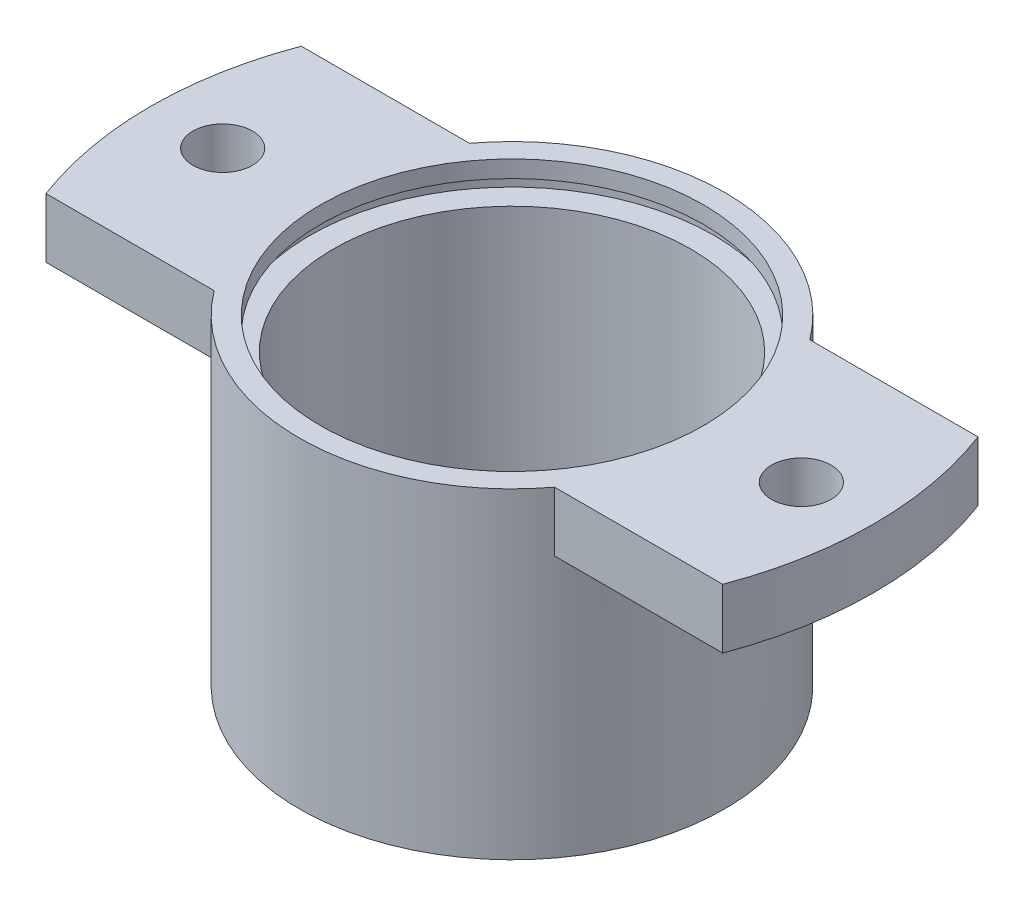
ISO-10303-21;
HEADER;
FILE_DESCRIPTION(('STEP AP214'),'2;1');
FILE_NAME('part.step','',(''),(''),'','','');
FILE_SCHEMA(('AUTOMOTIVE_DESIGN { 1 0 10303 214 1 1 1 1 }'));
ENDSEC;
DATA;
#1=APPLICATION_CONTEXT('core data for automotive mechanical design processes');
#2=APPLICATION_PROTOCOL_DEFINITION('international standard','automotive_design',2000,#1);
#3=PRODUCT_CONTEXT('',#1,'mechanical');
#4=PRODUCT('Part','Part','',(#3));
#5=PRODUCT_RELATED_PRODUCT_CATEGORY('part','',(#4));
#6=PRODUCT_DEFINITION_FORMATION('','',#4);
#7=PRODUCT_DEFINITION_CONTEXT('part definition',#1,'design');
#8=PRODUCT_DEFINITION('design','',#6,#7);
#9=PRODUCT_DEFINITION_SHAPE('','',#8);
#10=(LENGTH_UNIT() NAMED_UNIT(*) SI_UNIT(.MILLI.,.METRE.));
#11=(NAMED_UNIT(*) PLANE_ANGLE_UNIT() SI_UNIT($,.RADIAN.));
#12=(NAMED_UNIT(*) SI_UNIT($,.STERADIAN.) SOLID_ANGLE_UNIT());
#13=UNCERTAINTY_MEASURE_WITH_UNIT(LENGTH_MEASURE(1.E-05),#10,'distance_accuracy_value','');
#14=(GEOMETRIC_REPRESENTATION_CONTEXT(3) GLOBAL_UNCERTAINTY_ASSIGNED_CONTEXT((#13)) GLOBAL_UNIT_ASSIGNED_CONTEXT((#10,
#11,#12)) REPRESENTATION_CONTEXT('',''));
#15=CARTESIAN_POINT('',(0.,0.,0.));
#16=DIRECTION('',(0.,0.,1.));
#17=DIRECTION('',(1.,0.,0.));
#18=AXIS2_PLACEMENT_3D('',#15,#16,#17);
#19=CARTESIAN_POINT('',(0.,37.75,22.4999999999957));
#20=DIRECTION('',(0.,-1.,0.));
#21=DIRECTION('',(0.,0.,-1.));
#22=AXIS2_PLACEMENT_3D('',#19,#20,#21);
#23=PLANE('',#22);
#24=CARTESIAN_POINT('',(34.,37.75,0.));
#25=DIRECTION('',(0.,1.,0.));
#26=DIRECTION('',(0.,0.,1.));
#27=AXIS2_PLACEMENT_3D('',#24,#25,#26);
#28=CIRCLE('',#27,3.5);
#29=CARTESIAN_POINT('',(34.,37.75,3.5));
#30=VERTEX_POINT('',#29);
#31=EDGE_CURVE('E232',#30,#30,#28,.T.);
#32=ORIENTED_EDGE('',*,*,#31,.F.);
#33=EDGE_LOOP('',(#32));
#34=FACE_BOUND('',#33,.T.);
#35=CARTESIAN_POINT('',(-34.,37.75,0.));
#36=DIRECTION('',(0.,1.,0.));
#37=DIRECTION('',(0.,0.,1.));
#38=AXIS2_PLACEMENT_3D('',#35,#36,#37);
#39=CIRCLE('',#38,3.5);
#40=CARTESIAN_POINT('',(-34.,37.75,3.5));
#41=VERTEX_POINT('',#40);
#42=EDGE_CURVE('E122',#41,#41,#39,.T.);
#43=ORIENTED_EDGE('',*,*,#42,.F.);
#44=EDGE_LOOP('',(#43));
#45=FACE_BOUND('',#44,.T.);
#46=CARTESIAN_POINT('',(0.,37.75,0.));
#47=DIRECTION('',(0.,-1.,0.));
#48=DIRECTION('',(0.,0.,-1.));
#49=AXIS2_PLACEMENT_3D('',#46,#47,#48);
#50=CIRCLE('',#49,25.);
#51=CARTESIAN_POINT('',(-20.,37.75,-15.));
#52=VERTEX_POINT('',#51);
#53=CARTESIAN_POINT('',(20.,37.75,-15.));
#54=VERTEX_POINT('',#53);
#55=EDGE_CURVE('E11',#52,#54,#50,.T.);
#56=ORIENTED_EDGE('',*,*,#55,.F.);
#57=DIRECTION('',(-1.,0.,0.));
#58=VECTOR('',#57,1.);
#59=CARTESIAN_POINT('',(-20.,37.75,-15.));
#60=LINE('',#59,#58);
#61=CARTESIAN_POINT('',(-39.7649343014672,37.75,-15.));
#62=VERTEX_POINT('',#61);
#63=EDGE_CURVE('E132',#52,#62,#60,.T.);
#64=ORIENTED_EDGE('',*,*,#63,.T.);
#65=CARTESIAN_POINT('',(0.,37.75,0.));
#66=DIRECTION('',(0.,1.,0.));
#67=DIRECTION('',(0.,0.,1.));
#68=AXIS2_PLACEMENT_3D('',#65,#66,#67);
#69=CIRCLE('',#68,42.5);
#70=CARTESIAN_POINT('',(-39.7649343014672,37.75,15.));
#71=VERTEX_POINT('',#70);
#72=EDGE_CURVE('E151',#62,#71,#69,.T.);
#73=ORIENTED_EDGE('',*,*,#72,.T.);
#74=DIRECTION('',(1.,0.,0.));
#75=VECTOR('',#74,1.);
#76=CARTESIAN_POINT('',(-39.7649343014672,37.75,15.));
#77=LINE('',#76,#75);
#78=CARTESIAN_POINT('',(-20.,37.75,15.));
#79=VERTEX_POINT('',#78);
#80=EDGE_CURVE('E139',#71,#79,#77,.T.);
#81=ORIENTED_EDGE('',*,*,#80,.T.);
#82=CARTESIAN_POINT('',(20.,37.75,15.));
#83=VERTEX_POINT('',#82);
#84=EDGE_CURVE('E41',#83,#79,#50,.T.);
#85=ORIENTED_EDGE('',*,*,#84,.F.);
#86=DIRECTION('',(1.,0.,0.));
#87=VECTOR('',#86,1.);
#88=CARTESIAN_POINT('',(20.,37.75,15.));
#89=LINE('',#88,#87);
#90=CARTESIAN_POINT('',(39.7649343014672,37.75,15.));
#91=VERTEX_POINT('',#90);
#92=EDGE_CURVE('E117',#83,#91,#89,.T.);
#93=ORIENTED_EDGE('',*,*,#92,.T.);
#94=CARTESIAN_POINT('',(0.,37.75,0.));
#95=DIRECTION('',(0.,1.,0.));
#96=DIRECTION('',(0.,0.,1.));
#97=AXIS2_PLACEMENT_3D('',#94,#95,#96);
#98=CIRCLE('',#97,42.5);
#99=CARTESIAN_POINT('',(39.7649343014672,37.75,-15.));
#100=VERTEX_POINT('',#99);
#101=EDGE_CURVE('E127',#91,#100,#98,.T.);
#102=ORIENTED_EDGE('',*,*,#101,.T.);
#103=DIRECTION('',(-1.,0.,0.));
#104=VECTOR('',#103,1.);
#105=CARTESIAN_POINT('',(39.7649343014672,37.75,-15.));
#106=LINE('',#105,#104);
#107=EDGE_CURVE('E101',#100,#54,#106,.T.);
#108=ORIENTED_EDGE('',*,*,#107,.T.);
#109=EDGE_LOOP('',(#56,#64,#73,#81,#85,#93,#102,#108));
#110=FACE_BOUND('',#109,.T.);
#111=CARTESIAN_POINT('',(0.,37.75,0.));
#112=DIRECTION('',(0.,-1.,0.));
#113=DIRECTION('',(0.,0.,-1.));
#114=AXIS2_PLACEMENT_3D('',#111,#112,#113);
#115=CIRCLE('',#114,22.4999999999957);
#116=CARTESIAN_POINT('',(0.,37.75,-22.4999999999957));
#117=VERTEX_POINT('',#116);
#118=EDGE_CURVE('E159',#117,#117,#115,.T.);
#119=ORIENTED_EDGE('',*,*,#118,.T.);
#120=EDGE_LOOP('',(#119));
#121=FACE_BOUND('',#120,.T.);
#122=ADVANCED_FACE('F34',(#34,#45,#110,#121),#23,.F.);
#123=CARTESIAN_POINT('',(0.,-1.11792486059608,0.));
#124=DIRECTION('',(0.,-1.,0.));
#125=DIRECTION('',(0.,0.,-1.));
#126=AXIS2_PLACEMENT_3D('',#123,#124,#125);
#127=CYLINDRICAL_SURFACE('',#126,25.);
#128=CARTESIAN_POINT('',(0.,30.75,0.));
#129=DIRECTION('',(0.,-1.,0.));
#130=DIRECTION('',(0.,0.,1.));
#131=AXIS2_PLACEMENT_3D('',#128,#129,#130);
#132=CIRCLE('',#131,25.);
#133=CARTESIAN_POINT('',(20.,30.75,-15.));
#134=VERTEX_POINT('',#133);
#135=CARTESIAN_POINT('',(20.,30.75,15.));
#136=VERTEX_POINT('',#135);
#137=EDGE_CURVE('E51',#134,#136,#132,.T.);
#138=ORIENTED_EDGE('',*,*,#137,.T.);
#139=DIRECTION('',(0.,1.,0.));
#140=VECTOR('',#139,1.);
#141=CARTESIAN_POINT('',(20.,30.75,15.));
#142=LINE('',#141,#140);
#143=EDGE_CURVE('E133',#136,#83,#142,.T.);
#144=ORIENTED_EDGE('',*,*,#143,.T.);
#145=ORIENTED_EDGE('',*,*,#84,.T.);
#146=DIRECTION('',(0.,1.,0.));
#147=VECTOR('',#146,1.);
#148=CARTESIAN_POINT('',(-20.,30.75,15.));
#149=LINE('',#148,#147);
#150=CARTESIAN_POINT('',(-20.,30.75,15.));
#151=VERTEX_POINT('',#150);
#152=EDGE_CURVE('E156',#151,#79,#149,.T.);
#153=ORIENTED_EDGE('',*,*,#152,.F.);
#154=CARTESIAN_POINT('',(0.,30.75,0.));
#155=DIRECTION('',(0.,-1.,0.));
#156=DIRECTION('',(0.,0.,1.));
#157=AXIS2_PLACEMENT_3D('',#154,#155,#156);
#158=CIRCLE('',#157,25.);
#159=CARTESIAN_POINT('',(-20.,30.75,-15.));
#160=VERTEX_POINT('',#159);
#161=EDGE_CURVE('E136',#151,#160,#158,.T.);
#162=ORIENTED_EDGE('',*,*,#161,.T.);
#163=DIRECTION('',(0.,1.,0.));
#164=VECTOR('',#163,1.);
#165=CARTESIAN_POINT('',(-20.,30.75,-15.));
#166=LINE('',#165,#164);
#167=EDGE_CURVE('E148',#160,#52,#166,.T.);
#168=ORIENTED_EDGE('',*,*,#167,.T.);
#169=ORIENTED_EDGE('',*,*,#55,.T.);
#170=DIRECTION('',(0.,1.,0.));
#171=VECTOR('',#170,1.);
#172=CARTESIAN_POINT('',(20.,30.75,-15.));
#173=LINE('',#172,#171);
#174=EDGE_CURVE('E47',#134,#54,#173,.T.);
#175=ORIENTED_EDGE('',*,*,#174,.F.);
#176=EDGE_LOOP('',(#138,#144,#145,#153,#162,#168,#169,#175));
#177=FACE_BOUND('',#176,.T.);
#178=CARTESIAN_POINT('',(0.,0.,0.));
#179=DIRECTION('',(0.,-1.,0.));
#180=DIRECTION('',(0.,0.,-1.));
#181=AXIS2_PLACEMENT_3D('',#178,#179,#180);
#182=CIRCLE('',#181,25.);
#183=CARTESIAN_POINT('',(0.,0.,-25.));
#184=VERTEX_POINT('',#183);
#185=EDGE_CURVE('E188',#184,#184,#182,.T.);
#186=ORIENTED_EDGE('',*,*,#185,.F.);
#187=EDGE_LOOP('',(#186));
#188=FACE_BOUND('',#187,.T.);
#189=ADVANCED_FACE('F192',(#177,#188),#127,.T.);
#190=CARTESIAN_POINT('',(0.,0.,25.));
#191=DIRECTION('',(0.,1.,0.));
#192=DIRECTION('',(0.,0.,1.));
#193=AXIS2_PLACEMENT_3D('',#190,#191,#192);
#194=PLANE('',#193);
#195=CARTESIAN_POINT('',(0.,0.,0.));
#196=DIRECTION('',(0.,-1.,0.));
#197=DIRECTION('',(0.,0.,-1.));
#198=AXIS2_PLACEMENT_3D('',#195,#196,#197);
#199=CIRCLE('',#198,18.);
#200=CARTESIAN_POINT('',(0.,0.,-18.));
#201=VERTEX_POINT('',#200);
#202=EDGE_CURVE('E186',#201,#201,#199,.T.);
#203=ORIENTED_EDGE('',*,*,#202,.F.);
#204=EDGE_LOOP('',(#203));
#205=FACE_BOUND('',#204,.T.);
#206=ORIENTED_EDGE('',*,*,#185,.T.);
#207=EDGE_LOOP('',(#206));
#208=FACE_BOUND('',#207,.T.);
#209=ADVANCED_FACE('F228',(#205,#208),#194,.F.);
#210=CARTESIAN_POINT('',(0.,-1.11792486059608,0.));
#211=DIRECTION('',(0.,-1.,0.));
#212=DIRECTION('',(0.,0.,-1.));
#213=AXIS2_PLACEMENT_3D('',#210,#211,#212);
#214=CYLINDRICAL_SURFACE('',#213,18.);
#215=CARTESIAN_POINT('',(0.,2.,0.));
#216=DIRECTION('',(0.,-1.,0.));
#217=DIRECTION('',(0.,0.,-1.));
#218=AXIS2_PLACEMENT_3D('',#215,#216,#217);
#219=CIRCLE('',#218,18.);
#220=CARTESIAN_POINT('',(0.,2.,-18.));
#221=VERTEX_POINT('',#220);
#222=EDGE_CURVE('E183',#221,#221,#219,.T.);
#223=ORIENTED_EDGE('',*,*,#222,.F.);
#224=EDGE_LOOP('',(#223));
#225=FACE_BOUND('',#224,.T.);
#226=ORIENTED_EDGE('',*,*,#202,.T.);
#227=EDGE_LOOP('',(#226));
#228=FACE_BOUND('',#227,.T.);
#229=ADVANCED_FACE('F296',(#225,#228),#214,.F.);
#230=CARTESIAN_POINT('',(0.,2.,18.));
#231=DIRECTION('',(0.,-1.,0.));
#232=DIRECTION('',(0.,0.,-1.));
#233=AXIS2_PLACEMENT_3D('',#230,#231,#232);
#234=PLANE('',#233);
#235=CARTESIAN_POINT('',(0.,2.,0.));
#236=DIRECTION('',(0.,-1.,0.));
#237=DIRECTION('',(0.,0.,-1.));
#238=AXIS2_PLACEMENT_3D('',#235,#236,#237);
#239=CIRCLE('',#238,21.);
#240=CARTESIAN_POINT('',(0.,2.,-21.));
#241=VERTEX_POINT('',#240);
#242=EDGE_CURVE('E180',#241,#241,#239,.T.);
#243=ORIENTED_EDGE('',*,*,#242,.F.);
#244=EDGE_LOOP('',(#243));
#245=FACE_BOUND('',#244,.T.);
#246=ORIENTED_EDGE('',*,*,#222,.T.);
#247=EDGE_LOOP('',(#246));
#248=FACE_BOUND('',#247,.T.);
#249=ADVANCED_FACE('F292',(#245,#248),#234,.F.);
#250=CARTESIAN_POINT('',(0.,-1.11792486059608,0.));
#251=DIRECTION('',(0.,-1.,0.));
#252=DIRECTION('',(0.,0.,-1.));
#253=AXIS2_PLACEMENT_3D('',#250,#251,#252);
#254=CYLINDRICAL_SURFACE('',#253,21.);
#255=CARTESIAN_POINT('',(0.,34.,0.));
#256=DIRECTION('',(0.,-1.,0.));
#257=DIRECTION('',(0.,0.,-1.));
#258=AXIS2_PLACEMENT_3D('',#255,#256,#257);
#259=CIRCLE('',#258,21.);
#260=CARTESIAN_POINT('',(0.,34.,-21.));
#261=VERTEX_POINT('',#260);
#262=EDGE_CURVE('E177',#261,#261,#259,.T.);
#263=ORIENTED_EDGE('',*,*,#262,.F.);
#264=EDGE_LOOP('',(#263));
#265=FACE_BOUND('',#264,.T.);
#266=ORIENTED_EDGE('',*,*,#242,.T.);
#267=EDGE_LOOP('',(#266));
#268=FACE_BOUND('',#267,.T.);
#269=ADVANCED_FACE('F288',(#265,#268),#254,.F.);
#270=CARTESIAN_POINT('',(0.,34.,21.));
#271=DIRECTION('',(0.,-1.,0.));
#272=DIRECTION('',(0.,0.,-1.));
#273=AXIS2_PLACEMENT_3D('',#270,#271,#272);
#274=PLANE('',#273);
#275=CARTESIAN_POINT('',(0.,34.,0.));
#276=DIRECTION('',(0.,-1.,0.));
#277=DIRECTION('',(0.,0.,-1.));
#278=AXIS2_PLACEMENT_3D('',#275,#276,#277);
#279=CIRCLE('',#278,23.75);
#280=CARTESIAN_POINT('',(0.,34.,-23.75));
#281=VERTEX_POINT('',#280);
#282=EDGE_CURVE('E174',#281,#281,#279,.T.);
#283=ORIENTED_EDGE('',*,*,#282,.F.);
#284=EDGE_LOOP('',(#283));
#285=FACE_BOUND('',#284,.T.);
#286=ORIENTED_EDGE('',*,*,#262,.T.);
#287=EDGE_LOOP('',(#286));
#288=FACE_BOUND('',#287,.T.);
#289=ADVANCED_FACE('F284',(#285,#288),#274,.F.);
#290=CARTESIAN_POINT('',(0.,-1.11792486059608,0.));
#291=DIRECTION('',(0.,-1.,0.));
#292=DIRECTION('',(0.,0.,-1.));
#293=AXIS2_PLACEMENT_3D('',#290,#291,#292);
#294=CYLINDRICAL_SURFACE('',#293,23.75);
#295=CARTESIAN_POINT('',(0.,35.75,0.));
#296=DIRECTION('',(0.,-1.,0.));
#297=DIRECTION('',(0.,0.,-1.));
#298=AXIS2_PLACEMENT_3D('',#295,#296,#297);
#299=CIRCLE('',#298,23.75);
#300=CARTESIAN_POINT('',(0.,35.75,-23.75));
#301=VERTEX_POINT('',#300);
#302=EDGE_CURVE('E171',#301,#301,#299,.T.);
#303=ORIENTED_EDGE('',*,*,#302,.F.);
#304=EDGE_LOOP('',(#303));
#305=FACE_BOUND('',#304,.T.);
#306=ORIENTED_EDGE('',*,*,#282,.T.);
#307=EDGE_LOOP('',(#306));
#308=FACE_BOUND('',#307,.T.);
#309=ADVANCED_FACE('F276',(#305,#308),#294,.F.);
#310=CARTESIAN_POINT('',(0.,35.75,23.75));
#311=DIRECTION('',(0.,1.,0.));
#312=DIRECTION('',(0.,0.,1.));
#313=AXIS2_PLACEMENT_3D('',#310,#311,#312);
#314=PLANE('',#313);
#315=CARTESIAN_POINT('',(0.,35.75,0.));
#316=DIRECTION('',(0.,-1.,0.));
#317=DIRECTION('',(0.,0.,-1.));
#318=AXIS2_PLACEMENT_3D('',#315,#316,#317);
#319=CIRCLE('',#318,22.4999999999957);
#320=CARTESIAN_POINT('',(0.,35.75,-22.4999999999957));
#321=VERTEX_POINT('',#320);
#322=EDGE_CURVE('E168',#321,#321,#319,.T.);
#323=ORIENTED_EDGE('',*,*,#322,.F.);
#324=EDGE_LOOP('',(#323));
#325=FACE_BOUND('',#324,.T.);
#326=ORIENTED_EDGE('',*,*,#302,.T.);
#327=EDGE_LOOP('',(#326));
#328=FACE_BOUND('',#327,.T.);
#329=ADVANCED_FACE('F271',(#325,#328),#314,.F.);
#330=CARTESIAN_POINT('',(0.,-1.11792486059608,0.));
#331=DIRECTION('',(0.,-1.,0.));
#332=DIRECTION('',(0.,0.,-1.));
#333=AXIS2_PLACEMENT_3D('',#330,#331,#332);
#334=CYLINDRICAL_SURFACE('',#333,22.4999999999957);
#335=ORIENTED_EDGE('',*,*,#118,.F.);
#336=EDGE_LOOP('',(#335));
#337=FACE_BOUND('',#336,.T.);
#338=ORIENTED_EDGE('',*,*,#322,.T.);
#339=EDGE_LOOP('',(#338));
#340=FACE_BOUND('',#339,.T.);
#341=ADVANCED_FACE('F267',(#337,#340),#334,.F.);
#342=CARTESIAN_POINT('',(-39.7649343014672,30.75,15.));
#343=DIRECTION('',(0.,0.,1.));
#344=DIRECTION('',(1.,0.,0.));
#345=AXIS2_PLACEMENT_3D('',#342,#343,#344);
#346=PLANE('',#345);
#347=ORIENTED_EDGE('',*,*,#80,.F.);
#348=DIRECTION('',(0.,1.,0.));
#349=VECTOR('',#348,1.);
#350=CARTESIAN_POINT('',(-39.7649343014672,30.75,15.));
#351=LINE('',#350,#349);
#352=CARTESIAN_POINT('',(-39.7649343014672,30.75,15.));
#353=VERTEX_POINT('',#352);
#354=EDGE_CURVE('E160',#353,#71,#351,.T.);
#355=ORIENTED_EDGE('',*,*,#354,.F.);
#356=DIRECTION('',(1.,0.,0.));
#357=VECTOR('',#356,1.);
#358=CARTESIAN_POINT('',(-39.7649343014672,30.75,15.));
#359=LINE('',#358,#357);
#360=EDGE_CURVE('E145',#353,#151,#359,.T.);
#361=ORIENTED_EDGE('',*,*,#360,.T.);
#362=ORIENTED_EDGE('',*,*,#152,.T.);
#363=EDGE_LOOP('',(#347,#355,#361,#362));
#364=FACE_BOUND('',#363,.T.);
#365=ADVANCED_FACE('F199',(#364),#346,.T.);
#366=CARTESIAN_POINT('',(0.,30.75,0.));
#367=DIRECTION('',(0.,1.,0.));
#368=DIRECTION('',(0.,0.,1.));
#369=AXIS2_PLACEMENT_3D('',#366,#367,#368);
#370=CYLINDRICAL_SURFACE('',#369,42.5);
#371=ORIENTED_EDGE('',*,*,#72,.F.);
#372=DIRECTION('',(0.,1.,0.));
#373=VECTOR('',#372,1.);
#374=CARTESIAN_POINT('',(-39.7649343014672,30.75,-15.));
#375=LINE('',#374,#373);
#376=CARTESIAN_POINT('',(-39.7649343014672,30.75,-15.));
#377=VERTEX_POINT('',#376);
#378=EDGE_CURVE('E162',#377,#62,#375,.T.);
#379=ORIENTED_EDGE('',*,*,#378,.F.);
#380=CARTESIAN_POINT('',(0.,30.75,0.));
#381=DIRECTION('',(0.,1.,0.));
#382=DIRECTION('',(0.,0.,1.));
#383=AXIS2_PLACEMENT_3D('',#380,#381,#382);
#384=CIRCLE('',#383,42.5);
#385=EDGE_CURVE('E142',#377,#353,#384,.T.);
#386=ORIENTED_EDGE('',*,*,#385,.T.);
#387=ORIENTED_EDGE('',*,*,#354,.T.);
#388=EDGE_LOOP('',(#371,#379,#386,#387));
#389=FACE_BOUND('',#388,.T.);
#390=ADVANCED_FACE('F205',(#389),#370,.T.);
#391=CARTESIAN_POINT('',(-20.,30.75,-15.));
#392=DIRECTION('',(0.,0.,-1.));
#393=DIRECTION('',(-1.,0.,0.));
#394=AXIS2_PLACEMENT_3D('',#391,#392,#393);
#395=PLANE('',#394);
#396=ORIENTED_EDGE('',*,*,#63,.F.);
#397=ORIENTED_EDGE('',*,*,#167,.F.);
#398=DIRECTION('',(-1.,0.,0.));
#399=VECTOR('',#398,1.);
#400=CARTESIAN_POINT('',(-20.,30.75,-15.));
#401=LINE('',#400,#399);
#402=EDGE_CURVE('E138',#160,#377,#401,.T.);
#403=ORIENTED_EDGE('',*,*,#402,.T.);
#404=ORIENTED_EDGE('',*,*,#378,.T.);
#405=EDGE_LOOP('',(#396,#397,#403,#404));
#406=FACE_BOUND('',#405,.T.);
#407=ADVANCED_FACE('F212',(#406),#395,.T.);
#408=CARTESIAN_POINT('',(0.,30.75,0.));
#409=DIRECTION('',(0.,1.,0.));
#410=DIRECTION('',(0.,0.,1.));
#411=AXIS2_PLACEMENT_3D('',#408,#409,#410);
#412=PLANE('',#411);
#413=CARTESIAN_POINT('',(-34.,30.75,0.));
#414=DIRECTION('',(0.,1.,0.));
#415=DIRECTION('',(0.,0.,1.));
#416=AXIS2_PLACEMENT_3D('',#413,#414,#415);
#417=CIRCLE('',#416,3.5);
#418=CARTESIAN_POINT('',(-34.,30.75,3.5));
#419=VERTEX_POINT('',#418);
#420=EDGE_CURVE('E236',#419,#419,#417,.T.);
#421=ORIENTED_EDGE('',*,*,#420,.T.);
#422=EDGE_LOOP('',(#421));
#423=FACE_BOUND('',#422,.T.);
#424=ORIENTED_EDGE('',*,*,#161,.F.);
#425=ORIENTED_EDGE('',*,*,#360,.F.);
#426=ORIENTED_EDGE('',*,*,#385,.F.);
#427=ORIENTED_EDGE('',*,*,#402,.F.);
#428=EDGE_LOOP('',(#424,#425,#426,#427));
#429=FACE_BOUND('',#428,.T.);
#430=ADVANCED_FACE('F209',(#423,#429),#412,.F.);
#431=CARTESIAN_POINT('',(0.,30.75,0.));
#432=DIRECTION('',(0.,1.,0.));
#433=DIRECTION('',(0.,0.,1.));
#434=AXIS2_PLACEMENT_3D('',#431,#432,#433);
#435=CYLINDRICAL_SURFACE('',#434,42.5);
#436=ORIENTED_EDGE('',*,*,#101,.F.);
#437=DIRECTION('',(0.,1.,0.));
#438=VECTOR('',#437,1.);
#439=CARTESIAN_POINT('',(39.7649343014672,30.75,15.));
#440=LINE('',#439,#438);
#441=CARTESIAN_POINT('',(39.7649343014672,30.75,15.));
#442=VERTEX_POINT('',#441);
#443=EDGE_CURVE('E116',#442,#91,#440,.T.);
#444=ORIENTED_EDGE('',*,*,#443,.F.);
#445=CARTESIAN_POINT('',(0.,30.75,0.));
#446=DIRECTION('',(0.,1.,0.));
#447=DIRECTION('',(0.,0.,1.));
#448=AXIS2_PLACEMENT_3D('',#445,#446,#447);
#449=CIRCLE('',#448,42.5);
#450=CARTESIAN_POINT('',(39.7649343014672,30.75,-15.));
#451=VERTEX_POINT('',#450);
#452=EDGE_CURVE('E112',#442,#451,#449,.T.);
#453=ORIENTED_EDGE('',*,*,#452,.T.);
#454=DIRECTION('',(0.,1.,0.));
#455=VECTOR('',#454,1.);
#456=CARTESIAN_POINT('',(39.7649343014672,30.75,-15.));
#457=LINE('',#456,#455);
#458=EDGE_CURVE('E96',#451,#100,#457,.T.);
#459=ORIENTED_EDGE('',*,*,#458,.T.);
#460=EDGE_LOOP('',(#436,#444,#453,#459));
#461=FACE_BOUND('',#460,.T.);
#462=ADVANCED_FACE('F115',(#461),#435,.T.);
#463=CARTESIAN_POINT('',(20.,30.75,15.));
#464=DIRECTION('',(0.,0.,1.));
#465=DIRECTION('',(1.,0.,0.));
#466=AXIS2_PLACEMENT_3D('',#463,#464,#465);
#467=PLANE('',#466);
#468=ORIENTED_EDGE('',*,*,#92,.F.);
#469=ORIENTED_EDGE('',*,*,#143,.F.);
#470=DIRECTION('',(1.,0.,0.));
#471=VECTOR('',#470,1.);
#472=CARTESIAN_POINT('',(20.,30.75,15.));
#473=LINE('',#472,#471);
#474=EDGE_CURVE('E106',#136,#442,#473,.T.);
#475=ORIENTED_EDGE('',*,*,#474,.T.);
#476=ORIENTED_EDGE('',*,*,#443,.T.);
#477=EDGE_LOOP('',(#468,#469,#475,#476));
#478=FACE_BOUND('',#477,.T.);
#479=ADVANCED_FACE('F258',(#478),#467,.T.);
#480=CARTESIAN_POINT('',(39.7649343014672,30.75,-15.));
#481=DIRECTION('',(0.,0.,-1.));
#482=DIRECTION('',(-1.,0.,0.));
#483=AXIS2_PLACEMENT_3D('',#480,#481,#482);
#484=PLANE('',#483);
#485=ORIENTED_EDGE('',*,*,#107,.F.);
#486=ORIENTED_EDGE('',*,*,#458,.F.);
#487=DIRECTION('',(-1.,0.,0.));
#488=VECTOR('',#487,1.);
#489=CARTESIAN_POINT('',(39.7649343014672,30.75,-15.));
#490=LINE('',#489,#488);
#491=EDGE_CURVE('E99',#451,#134,#490,.T.);
#492=ORIENTED_EDGE('',*,*,#491,.T.);
#493=ORIENTED_EDGE('',*,*,#174,.T.);
#494=EDGE_LOOP('',(#485,#486,#492,#493));
#495=FACE_BOUND('',#494,.T.);
#496=ADVANCED_FACE('F98',(#495),#484,.T.);
#497=CARTESIAN_POINT('',(0.,30.75,0.));
#498=DIRECTION('',(0.,1.,0.));
#499=DIRECTION('',(0.,0.,1.));
#500=AXIS2_PLACEMENT_3D('',#497,#498,#499);
#501=PLANE('',#500);
#502=CARTESIAN_POINT('',(34.,30.75,0.));
#503=DIRECTION('',(0.,1.,0.));
#504=DIRECTION('',(0.,0.,1.));
#505=AXIS2_PLACEMENT_3D('',#502,#503,#504);
#506=CIRCLE('',#505,3.5);
#507=CARTESIAN_POINT('',(34.,30.75,3.5));
#508=VERTEX_POINT('',#507);
#509=EDGE_CURVE('E129',#508,#508,#506,.T.);
#510=ORIENTED_EDGE('',*,*,#509,.T.);
#511=EDGE_LOOP('',(#510));
#512=FACE_BOUND('',#511,.T.);
#513=ORIENTED_EDGE('',*,*,#452,.F.);
#514=ORIENTED_EDGE('',*,*,#474,.F.);
#515=ORIENTED_EDGE('',*,*,#137,.F.);
#516=ORIENTED_EDGE('',*,*,#491,.F.);
#517=EDGE_LOOP('',(#513,#514,#515,#516));
#518=FACE_BOUND('',#517,.T.);
#519=ADVANCED_FACE('F110',(#512,#518),#501,.F.);
#520=CARTESIAN_POINT('',(34.,30.75,0.));
#521=DIRECTION('',(0.,1.,0.));
#522=DIRECTION('',(0.,0.,1.));
#523=AXIS2_PLACEMENT_3D('',#520,#521,#522);
#524=CYLINDRICAL_SURFACE('',#523,3.5);
#525=ORIENTED_EDGE('',*,*,#509,.F.);
#526=EDGE_LOOP('',(#525));
#527=FACE_BOUND('',#526,.T.);
#528=ORIENTED_EDGE('',*,*,#31,.T.);
#529=EDGE_LOOP('',(#528));
#530=FACE_BOUND('',#529,.T.);
#531=ADVANCED_FACE('F245',(#527,#530),#524,.F.);
#532=CARTESIAN_POINT('',(-34.,30.75,0.));
#533=DIRECTION('',(0.,1.,0.));
#534=DIRECTION('',(0.,0.,1.));
#535=AXIS2_PLACEMENT_3D('',#532,#533,#534);
#536=CYLINDRICAL_SURFACE('',#535,3.5);
#537=ORIENTED_EDGE('',*,*,#420,.F.);
#538=EDGE_LOOP('',(#537));
#539=FACE_BOUND('',#538,.T.);
#540=ORIENTED_EDGE('',*,*,#42,.T.);
#541=EDGE_LOOP('',(#540));
#542=FACE_BOUND('',#541,.T.);
#543=ADVANCED_FACE('F248',(#539,#542),#536,.F.);
#544=CLOSED_SHELL('',(#122,#189,#209,#229,#249,#269,#289,#309,#329,#341,#365,#390,#407,#430,
#462,#479,#496,#519,#531,#543));
#545=MANIFOLD_SOLID_BREP('B2',#544);
#546=ADVANCED_BREP_SHAPE_REPRESENTATION('',(#18,#545),#14);
#547=SHAPE_DEFINITION_REPRESENTATION(#9,#546);
ENDSEC;
END-ISO-10303-21;
